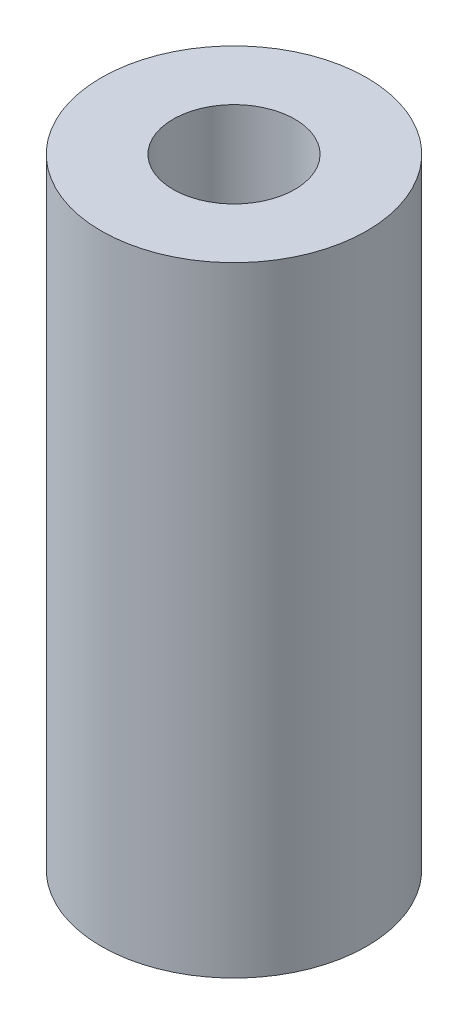
ISO-10303-21;
HEADER;
FILE_DESCRIPTION(('STEP AP214'),'2;1');
FILE_NAME('part.step','',(''),(''),'','','');
FILE_SCHEMA(('AUTOMOTIVE_DESIGN { 1 0 10303 214 1 1 1 1 }'));
ENDSEC;
DATA;
#1=APPLICATION_CONTEXT('core data for automotive mechanical design processes');
#2=APPLICATION_PROTOCOL_DEFINITION('international standard','automotive_design',2000,#1);
#3=PRODUCT_CONTEXT('',#1,'mechanical');
#4=PRODUCT('Part','Part','',(#3));
#5=PRODUCT_RELATED_PRODUCT_CATEGORY('part','',(#4));
#6=PRODUCT_DEFINITION_FORMATION('','',#4);
#7=PRODUCT_DEFINITION_CONTEXT('part definition',#1,'design');
#8=PRODUCT_DEFINITION('design','',#6,#7);
#9=PRODUCT_DEFINITION_SHAPE('','',#8);
#10=(LENGTH_UNIT() NAMED_UNIT(*) SI_UNIT(.MILLI.,.METRE.));
#11=(NAMED_UNIT(*) PLANE_ANGLE_UNIT() SI_UNIT($,.RADIAN.));
#12=(NAMED_UNIT(*) SI_UNIT($,.STERADIAN.) SOLID_ANGLE_UNIT());
#13=UNCERTAINTY_MEASURE_WITH_UNIT(LENGTH_MEASURE(1.E-05),#10,'distance_accuracy_value','');
#14=(GEOMETRIC_REPRESENTATION_CONTEXT(3) GLOBAL_UNCERTAINTY_ASSIGNED_CONTEXT((#13)) GLOBAL_UNIT_ASSIGNED_CONTEXT((#10,
#11,#12)) REPRESENTATION_CONTEXT('',''));
#15=CARTESIAN_POINT('',(0.,0.,0.));
#16=DIRECTION('',(0.,0.,1.));
#17=DIRECTION('',(1.,0.,0.));
#18=AXIS2_PLACEMENT_3D('',#15,#16,#17);
#19=CARTESIAN_POINT('',(0.,22.225,0.));
#20=DIRECTION('',(0.,1.,0.));
#21=DIRECTION('',(0.,0.,1.));
#22=AXIS2_PLACEMENT_3D('',#19,#20,#21);
#23=PLANE('',#22);
#24=CARTESIAN_POINT('',(0.,22.225,0.));
#25=DIRECTION('',(0.,1.,0.));
#26=DIRECTION('',(0.,0.,1.));
#27=AXIS2_PLACEMENT_3D('',#24,#25,#26);
#28=CIRCLE('',#27,4.7625);
#29=CARTESIAN_POINT('',(0.,22.225,4.7625));
#30=VERTEX_POINT('',#29);
#31=EDGE_CURVE('E10',#30,#30,#28,.T.);
#32=ORIENTED_EDGE('',*,*,#31,.T.);
#33=EDGE_LOOP('',(#32));
#34=FACE_BOUND('',#33,.T.);
#35=CARTESIAN_POINT('',(0.,22.225,0.));
#36=DIRECTION('',(0.,1.,0.));
#37=DIRECTION('',(0.,0.,1.));
#38=AXIS2_PLACEMENT_3D('',#35,#36,#37);
#39=CIRCLE('',#38,2.1844);
#40=CARTESIAN_POINT('',(0.,22.225,2.1844));
#41=VERTEX_POINT('',#40);
#42=EDGE_CURVE('E47',#41,#41,#39,.T.);
#43=ORIENTED_EDGE('',*,*,#42,.F.);
#44=EDGE_LOOP('',(#43));
#45=FACE_BOUND('',#44,.T.);
#46=ADVANCED_FACE('F36',(#34,#45),#23,.T.);
#47=CARTESIAN_POINT('',(0.,0.,0.));
#48=DIRECTION('',(0.,1.,0.));
#49=DIRECTION('',(0.,0.,1.));
#50=AXIS2_PLACEMENT_3D('',#47,#48,#49);
#51=PLANE('',#50);
#52=CARTESIAN_POINT('',(0.,0.,0.));
#53=DIRECTION('',(0.,1.,0.));
#54=DIRECTION('',(0.,0.,1.));
#55=AXIS2_PLACEMENT_3D('',#52,#53,#54);
#56=CIRCLE('',#55,4.7625);
#57=CARTESIAN_POINT('',(0.,0.,4.7625));
#58=VERTEX_POINT('',#57);
#59=EDGE_CURVE('E40',#58,#58,#56,.T.);
#60=ORIENTED_EDGE('',*,*,#59,.F.);
#61=EDGE_LOOP('',(#60));
#62=FACE_BOUND('',#61,.T.);
#63=CARTESIAN_POINT('',(0.,0.,0.));
#64=DIRECTION('',(0.,1.,0.));
#65=DIRECTION('',(0.,0.,1.));
#66=AXIS2_PLACEMENT_3D('',#63,#64,#65);
#67=CIRCLE('',#66,2.1844);
#68=CARTESIAN_POINT('',(0.,0.,2.1844));
#69=VERTEX_POINT('',#68);
#70=EDGE_CURVE('E49',#69,#69,#67,.T.);
#71=ORIENTED_EDGE('',*,*,#70,.T.);
#72=EDGE_LOOP('',(#71));
#73=FACE_BOUND('',#72,.T.);
#74=ADVANCED_FACE('F59',(#62,#73),#51,.F.);
#75=CARTESIAN_POINT('',(0.,22.225,0.));
#76=DIRECTION('',(0.,-1.,0.));
#77=DIRECTION('',(0.,0.,-1.));
#78=AXIS2_PLACEMENT_3D('',#75,#76,#77);
#79=CYLINDRICAL_SURFACE('',#78,4.7625);
#80=ORIENTED_EDGE('',*,*,#31,.F.);
#81=EDGE_LOOP('',(#80));
#82=FACE_BOUND('',#81,.T.);
#83=ORIENTED_EDGE('',*,*,#59,.T.);
#84=EDGE_LOOP('',(#83));
#85=FACE_BOUND('',#84,.T.);
#86=ADVANCED_FACE('F38',(#82,#85),#79,.T.);
#87=CARTESIAN_POINT('',(0.,22.225,0.));
#88=DIRECTION('',(0.,-1.,0.));
#89=DIRECTION('',(0.,0.,-1.));
#90=AXIS2_PLACEMENT_3D('',#87,#88,#89);
#91=CYLINDRICAL_SURFACE('',#90,2.1844);
#92=ORIENTED_EDGE('',*,*,#42,.T.);
#93=EDGE_LOOP('',(#92));
#94=FACE_BOUND('',#93,.T.);
#95=ORIENTED_EDGE('',*,*,#70,.F.);
#96=EDGE_LOOP('',(#95));
#97=FACE_BOUND('',#96,.T.);
#98=ADVANCED_FACE('F55',(#94,#97),#91,.F.);
#99=CLOSED_SHELL('',(#46,#74,#86,#98));
#100=MANIFOLD_SOLID_BREP('B2',#99);
#101=ADVANCED_BREP_SHAPE_REPRESENTATION('',(#18,#100),#14);
#102=SHAPE_DEFINITION_REPRESENTATION(#9,#101);
ENDSEC;
END-ISO-10303-21;
